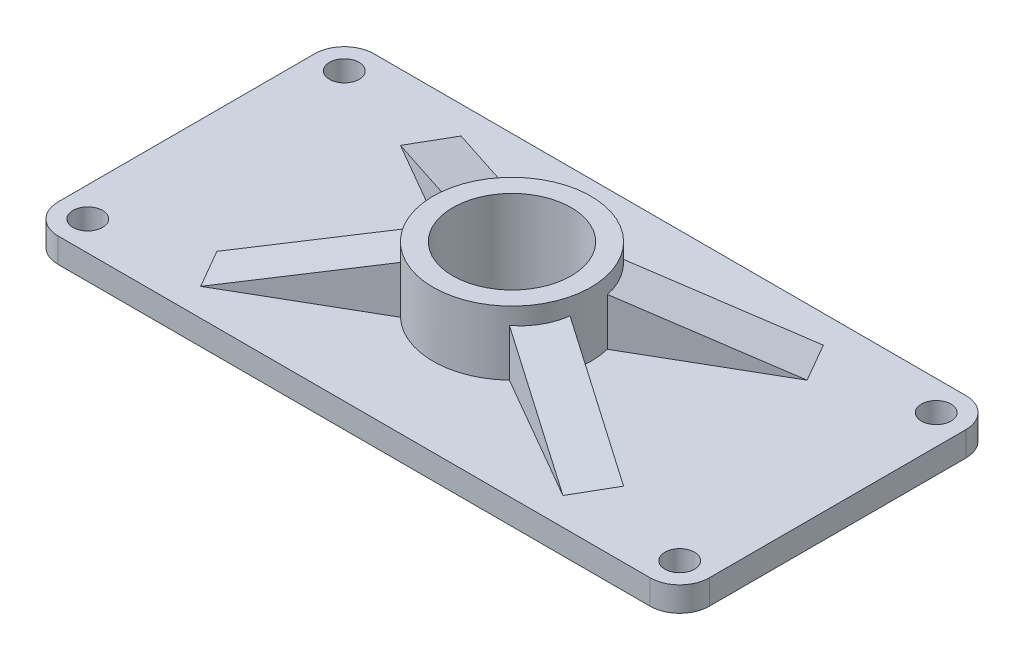
ISO-10303-21;
HEADER;
FILE_DESCRIPTION(('STEP AP214'),'2;1');
FILE_NAME('part.step','',(''),(''),'','','');
FILE_SCHEMA(('AUTOMOTIVE_DESIGN { 1 0 10303 214 1 1 1 1 }'));
ENDSEC;
DATA;
#1=APPLICATION_CONTEXT('core data for automotive mechanical design processes');
#2=APPLICATION_PROTOCOL_DEFINITION('international standard','automotive_design',2000,#1);
#3=PRODUCT_CONTEXT('',#1,'mechanical');
#4=PRODUCT('Part','Part','',(#3));
#5=PRODUCT_RELATED_PRODUCT_CATEGORY('part','',(#4));
#6=PRODUCT_DEFINITION_FORMATION('','',#4);
#7=PRODUCT_DEFINITION_CONTEXT('part definition',#1,'design');
#8=PRODUCT_DEFINITION('design','',#6,#7);
#9=PRODUCT_DEFINITION_SHAPE('','',#8);
#10=(LENGTH_UNIT() NAMED_UNIT(*) SI_UNIT(.MILLI.,.METRE.));
#11=(NAMED_UNIT(*) PLANE_ANGLE_UNIT() SI_UNIT($,.RADIAN.));
#12=(NAMED_UNIT(*) SI_UNIT($,.STERADIAN.) SOLID_ANGLE_UNIT());
#13=UNCERTAINTY_MEASURE_WITH_UNIT(LENGTH_MEASURE(1.E-05),#10,'distance_accuracy_value','');
#14=(GEOMETRIC_REPRESENTATION_CONTEXT(3) GLOBAL_UNCERTAINTY_ASSIGNED_CONTEXT((#13)) GLOBAL_UNIT_ASSIGNED_CONTEXT((#10,
#11,#12)) REPRESENTATION_CONTEXT('',''));
#15=CARTESIAN_POINT('',(0.,0.,0.));
#16=DIRECTION('',(0.,0.,1.));
#17=DIRECTION('',(1.,0.,0.));
#18=AXIS2_PLACEMENT_3D('',#15,#16,#17);
#19=CARTESIAN_POINT('',(0.,5.,0.));
#20=DIRECTION('',(0.,1.,0.));
#21=DIRECTION('',(0.,0.,1.));
#22=AXIS2_PLACEMENT_3D('',#19,#20,#21);
#23=PLANE('',#22);
#24=CARTESIAN_POINT('',(60.,5.,-26.));
#25=DIRECTION('',(0.,1.,0.));
#26=DIRECTION('',(0.,0.,1.));
#27=AXIS2_PLACEMENT_3D('',#24,#25,#26);
#28=CIRCLE('',#27,3.00000000000001);
#29=CARTESIAN_POINT('',(60.,5.,-23.));
#30=VERTEX_POINT('',#29);
#31=EDGE_CURVE('E246',#30,#30,#28,.T.);
#32=ORIENTED_EDGE('',*,*,#31,.F.);
#33=EDGE_LOOP('',(#32));
#34=FACE_BOUND('',#33,.T.);
#35=CARTESIAN_POINT('',(-60.,5.,-26.));
#36=DIRECTION('',(0.,1.,0.));
#37=DIRECTION('',(0.,0.,1.));
#38=AXIS2_PLACEMENT_3D('',#35,#36,#37);
#39=CIRCLE('',#38,3.);
#40=CARTESIAN_POINT('',(-60.,5.,-23.));
#41=VERTEX_POINT('',#40);
#42=EDGE_CURVE('E249',#41,#41,#39,.T.);
#43=ORIENTED_EDGE('',*,*,#42,.F.);
#44=EDGE_LOOP('',(#43));
#45=FACE_BOUND('',#44,.T.);
#46=CARTESIAN_POINT('',(-60.,5.,26.));
#47=DIRECTION('',(0.,1.,0.));
#48=DIRECTION('',(0.,0.,1.));
#49=AXIS2_PLACEMENT_3D('',#46,#47,#48);
#50=CIRCLE('',#49,3.);
#51=CARTESIAN_POINT('',(-60.,5.,29.));
#52=VERTEX_POINT('',#51);
#53=EDGE_CURVE('E253',#52,#52,#50,.T.);
#54=ORIENTED_EDGE('',*,*,#53,.F.);
#55=EDGE_LOOP('',(#54));
#56=FACE_BOUND('',#55,.T.);
#57=CARTESIAN_POINT('',(60.,5.,26.));
#58=DIRECTION('',(0.,1.,0.));
#59=DIRECTION('',(0.,0.,1.));
#60=AXIS2_PLACEMENT_3D('',#57,#58,#59);
#61=CIRCLE('',#60,3.00000000000001);
#62=CARTESIAN_POINT('',(60.,5.,29.));
#63=VERTEX_POINT('',#62);
#64=EDGE_CURVE('E256',#63,#63,#61,.T.);
#65=ORIENTED_EDGE('',*,*,#64,.F.);
#66=EDGE_LOOP('',(#65));
#67=FACE_BOUND('',#66,.T.);
#68=DIRECTION('',(-1.,0.,0.));
#69=VECTOR('',#68,1.);
#70=CARTESIAN_POINT('',(0.,5.,-32.));
#71=LINE('',#70,#69);
#72=CARTESIAN_POINT('',(60.,5.,-32.));
#73=VERTEX_POINT('',#72);
#74=CARTESIAN_POINT('',(-60.,5.,-32.));
#75=VERTEX_POINT('',#74);
#76=EDGE_CURVE('E262',#73,#75,#71,.T.);
#77=ORIENTED_EDGE('',*,*,#76,.T.);
#78=CARTESIAN_POINT('',(-60.,5.,-26.));
#79=DIRECTION('',(0.,1.,0.));
#80=DIRECTION('',(0.,0.,1.));
#81=AXIS2_PLACEMENT_3D('',#78,#79,#80);
#82=CIRCLE('',#81,6.);
#83=CARTESIAN_POINT('',(-66.,5.,-26.));
#84=VERTEX_POINT('',#83);
#85=EDGE_CURVE('E267',#75,#84,#82,.T.);
#86=ORIENTED_EDGE('',*,*,#85,.T.);
#87=DIRECTION('',(0.,0.,-1.));
#88=VECTOR('',#87,1.);
#89=CARTESIAN_POINT('',(-66.,5.,0.));
#90=LINE('',#89,#88);
#91=CARTESIAN_POINT('',(-66.,5.,26.));
#92=VERTEX_POINT('',#91);
#93=EDGE_CURVE('E269',#92,#84,#90,.T.);
#94=ORIENTED_EDGE('',*,*,#93,.F.);
#95=CARTESIAN_POINT('',(-60.,5.,26.));
#96=DIRECTION('',(0.,1.,0.));
#97=DIRECTION('',(0.,0.,1.));
#98=AXIS2_PLACEMENT_3D('',#95,#96,#97);
#99=CIRCLE('',#98,5.99999999999999);
#100=CARTESIAN_POINT('',(-60.,5.,32.));
#101=VERTEX_POINT('',#100);
#102=EDGE_CURVE('E272',#101,#92,#99,.F.);
#103=ORIENTED_EDGE('',*,*,#102,.F.);
#104=DIRECTION('',(-1.,0.,0.));
#105=VECTOR('',#104,1.);
#106=CARTESIAN_POINT('',(0.,5.,32.));
#107=LINE('',#106,#105);
#108=CARTESIAN_POINT('',(60.,5.,32.));
#109=VERTEX_POINT('',#108);
#110=EDGE_CURVE('E275',#109,#101,#107,.T.);
#111=ORIENTED_EDGE('',*,*,#110,.F.);
#112=CARTESIAN_POINT('',(60.,5.,26.));
#113=DIRECTION('',(0.,1.,0.));
#114=DIRECTION('',(0.,0.,1.));
#115=AXIS2_PLACEMENT_3D('',#112,#113,#114);
#116=CIRCLE('',#115,6.);
#117=CARTESIAN_POINT('',(66.,5.,26.));
#118=VERTEX_POINT('',#117);
#119=EDGE_CURVE('E278',#109,#118,#116,.T.);
#120=ORIENTED_EDGE('',*,*,#119,.T.);
#121=DIRECTION('',(0.,0.,-1.));
#122=VECTOR('',#121,1.);
#123=CARTESIAN_POINT('',(66.,5.,0.));
#124=LINE('',#123,#122);
#125=CARTESIAN_POINT('',(66.,5.,-26.));
#126=VERTEX_POINT('',#125);
#127=EDGE_CURVE('E280',#118,#126,#124,.T.);
#128=ORIENTED_EDGE('',*,*,#127,.T.);
#129=CARTESIAN_POINT('',(60.,5.,-26.));
#130=DIRECTION('',(0.,1.,0.));
#131=DIRECTION('',(0.,0.,1.));
#132=AXIS2_PLACEMENT_3D('',#129,#130,#131);
#133=CIRCLE('',#132,6.);
#134=EDGE_CURVE('E282',#126,#73,#133,.T.);
#135=ORIENTED_EDGE('',*,*,#134,.T.);
#136=EDGE_LOOP('',(#77,#86,#94,#103,#111,#120,#128,#135));
#137=FACE_BOUND('',#136,.T.);
#138=DIRECTION('',(-0.499999999999995,0.,-0.866025403784442));
#139=VECTOR('',#138,1.);
#140=CARTESIAN_POINT('',(41.2211431702999,4.99999999999999,-18.6028856829698));
#141=LINE('',#140,#139);
#142=CARTESIAN_POINT('',(41.2211431702999,4.99999999999999,-18.6028856829698));
#143=VERTEX_POINT('',#142);
#144=CARTESIAN_POINT('',(36.7211431702999,4.99999999999999,-26.3971143170298));
#145=VERTEX_POINT('',#144);
#146=EDGE_CURVE('E178',#143,#145,#141,.T.);
#147=ORIENTED_EDGE('',*,*,#146,.F.);
#148=DIRECTION('',(-0.866025403784442,0.,0.499999999999995));
#149=VECTOR('',#148,1.);
#150=CARTESIAN_POINT('',(41.2211431702999,4.99999999999999,-18.6028856829698));
#151=LINE('',#150,#149);
#152=CARTESIAN_POINT('',(15.5470861469722,5.,-3.77996194936197));
#153=VERTEX_POINT('',#152);
#154=EDGE_CURVE('E183',#143,#153,#151,.T.);
#155=ORIENTED_EDGE('',*,*,#154,.T.);
#156=CARTESIAN_POINT('',(0.,5.,0.));
#157=DIRECTION('',(0.,1.,0.));
#158=DIRECTION('',(0.,0.,1.));
#159=AXIS2_PLACEMENT_3D('',#156,#157,#158);
#160=CIRCLE('',#159,16.);
#161=CARTESIAN_POINT('',(15.5470861469722,5.,3.77996194936197));
#162=VERTEX_POINT('',#161);
#163=EDGE_CURVE('E264',#162,#153,#160,.T.);
#164=ORIENTED_EDGE('',*,*,#163,.F.);
#165=DIRECTION('',(-0.866025403784442,0.,-0.499999999999995));
#166=VECTOR('',#165,1.);
#167=CARTESIAN_POINT('',(41.2211431702999,4.99999999999999,18.6028856829698));
#168=LINE('',#167,#166);
#169=CARTESIAN_POINT('',(41.2211431702999,4.99999999999999,18.6028856829698));
#170=VERTEX_POINT('',#169);
#171=EDGE_CURVE('E213',#170,#162,#168,.T.);
#172=ORIENTED_EDGE('',*,*,#171,.F.);
#173=DIRECTION('',(-0.499999999999995,0.,0.866025403784442));
#174=VECTOR('',#173,1.);
#175=CARTESIAN_POINT('',(41.2211431702999,4.99999999999999,18.6028856829698));
#176=LINE('',#175,#174);
#177=CARTESIAN_POINT('',(36.7211431702999,4.99999999999999,26.3971143170298));
#178=VERTEX_POINT('',#177);
#179=EDGE_CURVE('E216',#170,#178,#176,.T.);
#180=ORIENTED_EDGE('',*,*,#179,.T.);
#181=DIRECTION('',(-0.866025403784442,0.,-0.499999999999995));
#182=VECTOR('',#181,1.);
#183=CARTESIAN_POINT('',(36.7211431702999,4.99999999999999,26.3971143170298));
#184=LINE('',#183,#182);
#185=CARTESIAN_POINT('',(11.0470861469723,5.,11.5741905834219));
#186=VERTEX_POINT('',#185);
#187=EDGE_CURVE('E214',#178,#186,#184,.T.);
#188=ORIENTED_EDGE('',*,*,#187,.T.);
#189=CARTESIAN_POINT('',(-11.0470861469723,5.,11.574190583422));
#190=VERTEX_POINT('',#189);
#191=EDGE_CURVE('E263',#190,#186,#160,.T.);
#192=ORIENTED_EDGE('',*,*,#191,.F.);
#193=DIRECTION('',(-0.866025403784442,0.,0.499999999999995));
#194=VECTOR('',#193,1.);
#195=CARTESIAN_POINT('',(-36.7211431702999,4.99999999999999,26.3971143170298));
#196=LINE('',#195,#194);
#197=CARTESIAN_POINT('',(-36.7211431702999,5.,26.3971143170298));
#198=VERTEX_POINT('',#197);
#199=EDGE_CURVE('E59',#190,#198,#196,.T.);
#200=ORIENTED_EDGE('',*,*,#199,.T.);
#201=DIRECTION('',(-0.499999999999995,0.,-0.866025403784442));
#202=VECTOR('',#201,1.);
#203=CARTESIAN_POINT('',(-36.7211431702999,4.99999999999999,26.3971143170298));
#204=LINE('',#203,#202);
#205=CARTESIAN_POINT('',(-41.2211431702999,5.,18.6028856829698));
#206=VERTEX_POINT('',#205);
#207=EDGE_CURVE('E202',#198,#206,#204,.T.);
#208=ORIENTED_EDGE('',*,*,#207,.T.);
#209=DIRECTION('',(-0.866025403784442,0.,0.499999999999995));
#210=VECTOR('',#209,1.);
#211=CARTESIAN_POINT('',(-41.2211431702999,4.99999999999999,18.6028856829698));
#212=LINE('',#211,#210);
#213=CARTESIAN_POINT('',(-15.5470861469722,5.,3.77996194936198));
#214=VERTEX_POINT('',#213);
#215=EDGE_CURVE('E200',#214,#206,#212,.T.);
#216=ORIENTED_EDGE('',*,*,#215,.F.);
#217=CARTESIAN_POINT('',(-15.5470861469722,5.,-3.77996194936198));
#218=VERTEX_POINT('',#217);
#219=EDGE_CURVE('E260',#218,#214,#160,.T.);
#220=ORIENTED_EDGE('',*,*,#219,.F.);
#221=DIRECTION('',(-0.866025403784442,0.,-0.499999999999995));
#222=VECTOR('',#221,1.);
#223=CARTESIAN_POINT('',(-41.2211431702999,4.99999999999999,-18.6028856829698));
#224=LINE('',#223,#222);
#225=CARTESIAN_POINT('',(-41.2211431702998,5.,-18.6028856829698));
#226=VERTEX_POINT('',#225);
#227=EDGE_CURVE('E222',#218,#226,#224,.T.);
#228=ORIENTED_EDGE('',*,*,#227,.T.);
#229=DIRECTION('',(-0.499999999999995,0.,0.866025403784442));
#230=VECTOR('',#229,1.);
#231=CARTESIAN_POINT('',(-36.7211431702999,4.99999999999999,-26.3971143170298));
#232=LINE('',#231,#230);
#233=CARTESIAN_POINT('',(-36.7211431702999,5.,-26.3971143170297));
#234=VERTEX_POINT('',#233);
#235=EDGE_CURVE('E230',#234,#226,#232,.T.);
#236=ORIENTED_EDGE('',*,*,#235,.F.);
#237=DIRECTION('',(-0.866025403784442,0.,-0.499999999999995));
#238=VECTOR('',#237,1.);
#239=CARTESIAN_POINT('',(-36.7211431702999,4.99999999999999,-26.3971143170298));
#240=LINE('',#239,#238);
#241=CARTESIAN_POINT('',(-11.0470861469723,5.,-11.574190583422));
#242=VERTEX_POINT('',#241);
#243=EDGE_CURVE('E223',#242,#234,#240,.T.);
#244=ORIENTED_EDGE('',*,*,#243,.F.);
#245=CARTESIAN_POINT('',(11.0470861469723,5.,-11.5741905834219));
#246=VERTEX_POINT('',#245);
#247=EDGE_CURVE('E259',#246,#242,#160,.T.);
#248=ORIENTED_EDGE('',*,*,#247,.F.);
#249=DIRECTION('',(-0.866025403784442,0.,0.499999999999995));
#250=VECTOR('',#249,1.);
#251=CARTESIAN_POINT('',(36.7211431702999,4.99999999999999,-26.3971143170298));
#252=LINE('',#251,#250);
#253=EDGE_CURVE('E51',#145,#246,#252,.T.);
#254=ORIENTED_EDGE('',*,*,#253,.F.);
#255=EDGE_LOOP('',(#147,#155,#164,#172,#180,#188,#192,#200,#208,#216,#220,#228,#236,#244,#248,#254));
#256=FACE_BOUND('',#255,.T.);
#257=ADVANCED_FACE('F36',(#34,#45,#56,#67,#137,#256),#23,.T.);
#258=CARTESIAN_POINT('',(0.,18.,0.));
#259=DIRECTION('',(0.,-1.,0.));
#260=DIRECTION('',(0.,0.,-1.));
#261=AXIS2_PLACEMENT_3D('',#258,#259,#260);
#262=CYLINDRICAL_SURFACE('',#261,16.);
#263=CARTESIAN_POINT('',(0.,18.,0.));
#264=DIRECTION('',(0.,1.,0.));
#265=DIRECTION('',(0.,0.,1.));
#266=AXIS2_PLACEMENT_3D('',#263,#264,#265);
#267=CIRCLE('',#266,16.);
#268=CARTESIAN_POINT('',(0.,18.,16.));
#269=VERTEX_POINT('',#268);
#270=EDGE_CURVE('E240',#269,#269,#267,.T.);
#271=ORIENTED_EDGE('',*,*,#270,.F.);
#272=EDGE_LOOP('',(#271));
#273=FACE_BOUND('',#272,.T.);
#274=DIRECTION('',(0.,-1.,0.));
#275=VECTOR('',#274,1.);
#276=CARTESIAN_POINT('',(15.5470861469722,18.,-3.77996194936197));
#277=LINE('',#276,#275);
#278=CARTESIAN_POINT('',(15.5470861469722,14.6325197536146,-3.77996194936197));
#279=VERTEX_POINT('',#278);
#280=EDGE_CURVE('E11',#279,#153,#277,.T.);
#281=ORIENTED_EDGE('',*,*,#280,.F.);
#282=CARTESIAN_POINT('',(0.,19.6213863304805,0.));
#283=DIRECTION('',(0.267616567329813,0.951056516295156,-0.154508497187469));
#284=DIRECTION('',(0.823639103546337,-0.309016994374941,-0.475528258147573));
#285=AXIS2_PLACEMENT_3D('',#282,#283,#284);
#286=ELLIPSE('',#285,16.8233955878122,16.);
#287=CARTESIAN_POINT('',(11.0470861469723,14.6325197536146,-11.5741905834219));
#288=VERTEX_POINT('',#287);
#289=EDGE_CURVE('E180',#279,#288,#286,.T.);
#290=ORIENTED_EDGE('',*,*,#289,.T.);
#291=DIRECTION('',(0.,-1.,0.));
#292=VECTOR('',#291,1.);
#293=CARTESIAN_POINT('',(11.0470861469723,18.,-11.5741905834219));
#294=LINE('',#293,#292);
#295=EDGE_CURVE('E44',#288,#246,#294,.T.);
#296=ORIENTED_EDGE('',*,*,#295,.T.);
#297=ORIENTED_EDGE('',*,*,#247,.T.);
#298=DIRECTION('',(0.,-1.,0.));
#299=VECTOR('',#298,1.);
#300=CARTESIAN_POINT('',(-11.0470861469723,18.,-11.574190583422));
#301=LINE('',#300,#299);
#302=CARTESIAN_POINT('',(-11.0470861469723,14.6325197536146,-11.574190583422));
#303=VERTEX_POINT('',#302);
#304=EDGE_CURVE('E341',#242,#303,#301,.F.);
#305=ORIENTED_EDGE('',*,*,#304,.T.);
#306=CARTESIAN_POINT('',(0.,19.6213863304805,0.));
#307=DIRECTION('',(0.267616567329813,-0.951056516295156,0.154508497187469));
#308=DIRECTION('',(-0.823639103546337,-0.309016994374941,-0.475528258147573));
#309=AXIS2_PLACEMENT_3D('',#306,#307,#308);
#310=ELLIPSE('',#309,16.8233955878122,16.);
#311=CARTESIAN_POINT('',(-15.5470861469722,14.6325197536146,-3.77996194936198));
#312=VERTEX_POINT('',#311);
#313=EDGE_CURVE('E338',#312,#303,#310,.T.);
#314=ORIENTED_EDGE('',*,*,#313,.F.);
#315=DIRECTION('',(0.,-1.,0.));
#316=VECTOR('',#315,1.);
#317=CARTESIAN_POINT('',(-15.5470861469722,18.,-3.77996194936198));
#318=LINE('',#317,#316);
#319=EDGE_CURVE('E335',#218,#312,#318,.F.);
#320=ORIENTED_EDGE('',*,*,#319,.F.);
#321=ORIENTED_EDGE('',*,*,#219,.T.);
#322=DIRECTION('',(0.,-1.,0.));
#323=VECTOR('',#322,1.);
#324=CARTESIAN_POINT('',(-15.5470861469722,18.,3.77996194936198));
#325=LINE('',#324,#323);
#326=CARTESIAN_POINT('',(-15.5470861469722,14.6325197536146,3.77996194936198));
#327=VERTEX_POINT('',#326);
#328=EDGE_CURVE('E351',#327,#214,#325,.T.);
#329=ORIENTED_EDGE('',*,*,#328,.F.);
#330=CARTESIAN_POINT('',(0.,19.6213863304805,0.));
#331=DIRECTION('',(-0.267616567329813,0.951056516295156,0.154508497187469));
#332=DIRECTION('',(-0.823639103546337,-0.309016994374941,0.475528258147573));
#333=AXIS2_PLACEMENT_3D('',#330,#331,#332);
#334=ELLIPSE('',#333,16.8233955878122,16.);
#335=CARTESIAN_POINT('',(-11.0470861469723,14.6325197536146,11.574190583422));
#336=VERTEX_POINT('',#335);
#337=EDGE_CURVE('E208',#327,#336,#334,.T.);
#338=ORIENTED_EDGE('',*,*,#337,.T.);
#339=DIRECTION('',(0.,-1.,0.));
#340=VECTOR('',#339,1.);
#341=CARTESIAN_POINT('',(-11.0470861469723,18.,11.574190583422));
#342=LINE('',#341,#340);
#343=EDGE_CURVE('E354',#336,#190,#342,.T.);
#344=ORIENTED_EDGE('',*,*,#343,.T.);
#345=ORIENTED_EDGE('',*,*,#191,.T.);
#346=DIRECTION('',(0.,-1.,0.));
#347=VECTOR('',#346,1.);
#348=CARTESIAN_POINT('',(11.0470861469723,18.,11.5741905834219));
#349=LINE('',#348,#347);
#350=CARTESIAN_POINT('',(11.0470861469723,14.6325197536146,11.5741905834219));
#351=VERTEX_POINT('',#350);
#352=EDGE_CURVE('E343',#186,#351,#349,.F.);
#353=ORIENTED_EDGE('',*,*,#352,.T.);
#354=CARTESIAN_POINT('',(0.,19.6213863304805,0.));
#355=DIRECTION('',(-0.267616567329813,-0.951056516295156,-0.154508497187469));
#356=DIRECTION('',(0.823639103546337,-0.309016994374941,0.475528258147573));
#357=AXIS2_PLACEMENT_3D('',#354,#355,#356);
#358=ELLIPSE('',#357,16.8233955878122,16.);
#359=CARTESIAN_POINT('',(15.5470861469722,14.6325197536146,3.77996194936197));
#360=VERTEX_POINT('',#359);
#361=EDGE_CURVE('E346',#360,#351,#358,.T.);
#362=ORIENTED_EDGE('',*,*,#361,.F.);
#363=DIRECTION('',(0.,-1.,0.));
#364=VECTOR('',#363,1.);
#365=CARTESIAN_POINT('',(15.5470861469722,18.,3.77996194936197));
#366=LINE('',#365,#364);
#367=EDGE_CURVE('E349',#162,#360,#366,.F.);
#368=ORIENTED_EDGE('',*,*,#367,.F.);
#369=ORIENTED_EDGE('',*,*,#163,.T.);
#370=EDGE_LOOP('',(#281,#290,#296,#297,#305,#314,#320,#321,#329,#338,#344,#345,#353,#362,#368,#369));
#371=FACE_BOUND('',#370,.T.);
#372=ADVANCED_FACE('F356',(#273,#371),#262,.T.);
#373=CARTESIAN_POINT('',(0.,5.,-32.));
#374=DIRECTION('',(0.,0.,1.));
#375=DIRECTION('',(1.,0.,0.));
#376=AXIS2_PLACEMENT_3D('',#373,#374,#375);
#377=PLANE('',#376);
#378=DIRECTION('',(-1.,0.,0.));
#379=VECTOR('',#378,1.);
#380=CARTESIAN_POINT('',(0.,0.,-32.));
#381=LINE('',#380,#379);
#382=CARTESIAN_POINT('',(60.,0.,-32.));
#383=VERTEX_POINT('',#382);
#384=CARTESIAN_POINT('',(-60.,0.,-32.));
#385=VERTEX_POINT('',#384);
#386=EDGE_CURVE('E296',#383,#385,#381,.T.);
#387=ORIENTED_EDGE('',*,*,#386,.T.);
#388=DIRECTION('',(0.,-1.,0.));
#389=VECTOR('',#388,1.);
#390=CARTESIAN_POINT('',(-60.,5.,-32.));
#391=LINE('',#390,#389);
#392=EDGE_CURVE('E332',#75,#385,#391,.T.);
#393=ORIENTED_EDGE('',*,*,#392,.F.);
#394=ORIENTED_EDGE('',*,*,#76,.F.);
#395=DIRECTION('',(0.,-1.,0.));
#396=VECTOR('',#395,1.);
#397=CARTESIAN_POINT('',(60.,5.,-32.));
#398=LINE('',#397,#396);
#399=EDGE_CURVE('E284',#73,#383,#398,.T.);
#400=ORIENTED_EDGE('',*,*,#399,.T.);
#401=EDGE_LOOP('',(#387,#393,#394,#400));
#402=FACE_BOUND('',#401,.T.);
#403=ADVANCED_FACE('F391',(#402),#377,.F.);
#404=CARTESIAN_POINT('',(-60.,5.,-26.));
#405=DIRECTION('',(0.,-1.,0.));
#406=DIRECTION('',(0.,0.,-1.));
#407=AXIS2_PLACEMENT_3D('',#404,#405,#406);
#408=CYLINDRICAL_SURFACE('',#407,6.);
#409=CARTESIAN_POINT('',(-60.,0.,-26.));
#410=DIRECTION('',(0.,1.,0.));
#411=DIRECTION('',(0.,0.,1.));
#412=AXIS2_PLACEMENT_3D('',#409,#410,#411);
#413=CIRCLE('',#412,6.);
#414=CARTESIAN_POINT('',(-66.,0.,-26.));
#415=VERTEX_POINT('',#414);
#416=EDGE_CURVE('E299',#385,#415,#413,.T.);
#417=ORIENTED_EDGE('',*,*,#416,.T.);
#418=DIRECTION('',(0.,-1.,0.));
#419=VECTOR('',#418,1.);
#420=CARTESIAN_POINT('',(-66.,5.,-26.));
#421=LINE('',#420,#419);
#422=EDGE_CURVE('E330',#84,#415,#421,.T.);
#423=ORIENTED_EDGE('',*,*,#422,.F.);
#424=ORIENTED_EDGE('',*,*,#85,.F.);
#425=ORIENTED_EDGE('',*,*,#392,.T.);
#426=EDGE_LOOP('',(#417,#423,#424,#425));
#427=FACE_BOUND('',#426,.T.);
#428=ADVANCED_FACE('F427',(#427),#408,.T.);
#429=CARTESIAN_POINT('',(-66.,5.,0.));
#430=DIRECTION('',(-1.,0.,0.));
#431=DIRECTION('',(0.,0.,1.));
#432=AXIS2_PLACEMENT_3D('',#429,#430,#431);
#433=PLANE('',#432);
#434=DIRECTION('',(0.,0.,-1.));
#435=VECTOR('',#434,1.);
#436=CARTESIAN_POINT('',(-66.,0.,0.));
#437=LINE('',#436,#435);
#438=CARTESIAN_POINT('',(-66.,0.,26.));
#439=VERTEX_POINT('',#438);
#440=EDGE_CURVE('E302',#439,#415,#437,.T.);
#441=ORIENTED_EDGE('',*,*,#440,.F.);
#442=DIRECTION('',(0.,-1.,0.));
#443=VECTOR('',#442,1.);
#444=CARTESIAN_POINT('',(-66.,5.,26.));
#445=LINE('',#444,#443);
#446=EDGE_CURVE('E328',#92,#439,#445,.T.);
#447=ORIENTED_EDGE('',*,*,#446,.F.);
#448=ORIENTED_EDGE('',*,*,#93,.T.);
#449=ORIENTED_EDGE('',*,*,#422,.T.);
#450=EDGE_LOOP('',(#441,#447,#448,#449));
#451=FACE_BOUND('',#450,.T.);
#452=ADVANCED_FACE('F423',(#451),#433,.T.);
#453=CARTESIAN_POINT('',(-60.,5.,26.));
#454=DIRECTION('',(0.,-1.,0.));
#455=DIRECTION('',(0.,0.,-1.));
#456=AXIS2_PLACEMENT_3D('',#453,#454,#455);
#457=CYLINDRICAL_SURFACE('',#456,5.99999999999999);
#458=CARTESIAN_POINT('',(-60.,0.,26.));
#459=DIRECTION('',(0.,1.,0.));
#460=DIRECTION('',(0.,0.,1.));
#461=AXIS2_PLACEMENT_3D('',#458,#459,#460);
#462=CIRCLE('',#461,5.99999999999999);
#463=CARTESIAN_POINT('',(-60.,0.,32.));
#464=VERTEX_POINT('',#463);
#465=EDGE_CURVE('E305',#464,#439,#462,.F.);
#466=ORIENTED_EDGE('',*,*,#465,.F.);
#467=DIRECTION('',(0.,-1.,0.));
#468=VECTOR('',#467,1.);
#469=CARTESIAN_POINT('',(-60.,5.,32.));
#470=LINE('',#469,#468);
#471=EDGE_CURVE('E326',#101,#464,#470,.T.);
#472=ORIENTED_EDGE('',*,*,#471,.F.);
#473=ORIENTED_EDGE('',*,*,#102,.T.);
#474=ORIENTED_EDGE('',*,*,#446,.T.);
#475=EDGE_LOOP('',(#466,#472,#473,#474));
#476=FACE_BOUND('',#475,.T.);
#477=ADVANCED_FACE('F419',(#476),#457,.T.);
#478=CARTESIAN_POINT('',(0.,5.,32.));
#479=DIRECTION('',(0.,0.,1.));
#480=DIRECTION('',(1.,0.,0.));
#481=AXIS2_PLACEMENT_3D('',#478,#479,#480);
#482=PLANE('',#481);
#483=DIRECTION('',(-1.,0.,0.));
#484=VECTOR('',#483,1.);
#485=CARTESIAN_POINT('',(0.,0.,32.));
#486=LINE('',#485,#484);
#487=CARTESIAN_POINT('',(60.,0.,32.));
#488=VERTEX_POINT('',#487);
#489=EDGE_CURVE('E308',#488,#464,#486,.T.);
#490=ORIENTED_EDGE('',*,*,#489,.F.);
#491=DIRECTION('',(0.,-1.,0.));
#492=VECTOR('',#491,1.);
#493=CARTESIAN_POINT('',(60.,5.,32.));
#494=LINE('',#493,#492);
#495=EDGE_CURVE('E324',#109,#488,#494,.T.);
#496=ORIENTED_EDGE('',*,*,#495,.F.);
#497=ORIENTED_EDGE('',*,*,#110,.T.);
#498=ORIENTED_EDGE('',*,*,#471,.T.);
#499=EDGE_LOOP('',(#490,#496,#497,#498));
#500=FACE_BOUND('',#499,.T.);
#501=ADVANCED_FACE('F415',(#500),#482,.T.);
#502=CARTESIAN_POINT('',(60.,5.,26.));
#503=DIRECTION('',(0.,-1.,0.));
#504=DIRECTION('',(0.,0.,-1.));
#505=AXIS2_PLACEMENT_3D('',#502,#503,#504);
#506=CYLINDRICAL_SURFACE('',#505,6.);
#507=CARTESIAN_POINT('',(60.,0.,26.));
#508=DIRECTION('',(0.,1.,0.));
#509=DIRECTION('',(0.,0.,1.));
#510=AXIS2_PLACEMENT_3D('',#507,#508,#509);
#511=CIRCLE('',#510,6.);
#512=CARTESIAN_POINT('',(66.,0.,26.));
#513=VERTEX_POINT('',#512);
#514=EDGE_CURVE('E311',#488,#513,#511,.T.);
#515=ORIENTED_EDGE('',*,*,#514,.T.);
#516=DIRECTION('',(0.,-1.,0.));
#517=VECTOR('',#516,1.);
#518=CARTESIAN_POINT('',(66.,5.,26.));
#519=LINE('',#518,#517);
#520=EDGE_CURVE('E321',#118,#513,#519,.T.);
#521=ORIENTED_EDGE('',*,*,#520,.F.);
#522=ORIENTED_EDGE('',*,*,#119,.F.);
#523=ORIENTED_EDGE('',*,*,#495,.T.);
#524=EDGE_LOOP('',(#515,#521,#522,#523));
#525=FACE_BOUND('',#524,.T.);
#526=ADVANCED_FACE('F411',(#525),#506,.T.);
#527=CARTESIAN_POINT('',(66.,5.,0.));
#528=DIRECTION('',(-1.,0.,0.));
#529=DIRECTION('',(0.,0.,1.));
#530=AXIS2_PLACEMENT_3D('',#527,#528,#529);
#531=PLANE('',#530);
#532=DIRECTION('',(0.,0.,-1.));
#533=VECTOR('',#532,1.);
#534=CARTESIAN_POINT('',(66.,0.,0.));
#535=LINE('',#534,#533);
#536=CARTESIAN_POINT('',(66.,0.,-26.));
#537=VERTEX_POINT('',#536);
#538=EDGE_CURVE('E313',#513,#537,#535,.T.);
#539=ORIENTED_EDGE('',*,*,#538,.T.);
#540=DIRECTION('',(0.,-1.,0.));
#541=VECTOR('',#540,1.);
#542=CARTESIAN_POINT('',(66.,5.,-26.));
#543=LINE('',#542,#541);
#544=EDGE_CURVE('E318',#126,#537,#543,.T.);
#545=ORIENTED_EDGE('',*,*,#544,.F.);
#546=ORIENTED_EDGE('',*,*,#127,.F.);
#547=ORIENTED_EDGE('',*,*,#520,.T.);
#548=EDGE_LOOP('',(#539,#545,#546,#547));
#549=FACE_BOUND('',#548,.T.);
#550=ADVANCED_FACE('F407',(#549),#531,.F.);
#551=CARTESIAN_POINT('',(60.,5.,26.));
#552=DIRECTION('',(0.,-1.,0.));
#553=DIRECTION('',(0.,0.,-1.));
#554=AXIS2_PLACEMENT_3D('',#551,#552,#553);
#555=CYLINDRICAL_SURFACE('',#554,3.00000000000001);
#556=ORIENTED_EDGE('',*,*,#64,.T.);
#557=EDGE_LOOP('',(#556));
#558=FACE_BOUND('',#557,.T.);
#559=CARTESIAN_POINT('',(60.,0.,26.));
#560=DIRECTION('',(0.,1.,0.));
#561=DIRECTION('',(0.,0.,1.));
#562=AXIS2_PLACEMENT_3D('',#559,#560,#561);
#563=CIRCLE('',#562,3.00000000000001);
#564=CARTESIAN_POINT('',(60.,0.,29.));
#565=VERTEX_POINT('',#564);
#566=EDGE_CURVE('E293',#565,#565,#563,.T.);
#567=ORIENTED_EDGE('',*,*,#566,.F.);
#568=EDGE_LOOP('',(#567));
#569=FACE_BOUND('',#568,.T.);
#570=ADVANCED_FACE('F410',(#558,#569),#555,.F.);
#571=CARTESIAN_POINT('',(-60.,5.,26.));
#572=DIRECTION('',(0.,-1.,0.));
#573=DIRECTION('',(0.,0.,-1.));
#574=AXIS2_PLACEMENT_3D('',#571,#572,#573);
#575=CYLINDRICAL_SURFACE('',#574,3.);
#576=ORIENTED_EDGE('',*,*,#53,.T.);
#577=EDGE_LOOP('',(#576));
#578=FACE_BOUND('',#577,.T.);
#579=CARTESIAN_POINT('',(-60.,0.,26.));
#580=DIRECTION('',(0.,1.,0.));
#581=DIRECTION('',(0.,0.,1.));
#582=AXIS2_PLACEMENT_3D('',#579,#580,#581);
#583=CIRCLE('',#582,3.);
#584=CARTESIAN_POINT('',(-60.,0.,29.));
#585=VERTEX_POINT('',#584);
#586=EDGE_CURVE('E290',#585,#585,#583,.T.);
#587=ORIENTED_EDGE('',*,*,#586,.F.);
#588=EDGE_LOOP('',(#587));
#589=FACE_BOUND('',#588,.T.);
#590=ADVANCED_FACE('F437',(#578,#589),#575,.F.);
#591=CARTESIAN_POINT('',(-60.,5.,-26.));
#592=DIRECTION('',(0.,-1.,0.));
#593=DIRECTION('',(0.,0.,-1.));
#594=AXIS2_PLACEMENT_3D('',#591,#592,#593);
#595=CYLINDRICAL_SURFACE('',#594,3.);
#596=ORIENTED_EDGE('',*,*,#42,.T.);
#597=EDGE_LOOP('',(#596));
#598=FACE_BOUND('',#597,.T.);
#599=CARTESIAN_POINT('',(-60.,0.,-26.));
#600=DIRECTION('',(0.,1.,0.));
#601=DIRECTION('',(0.,0.,1.));
#602=AXIS2_PLACEMENT_3D('',#599,#600,#601);
#603=CIRCLE('',#602,3.);
#604=CARTESIAN_POINT('',(-60.,0.,-23.));
#605=VERTEX_POINT('',#604);
#606=EDGE_CURVE('E287',#605,#605,#603,.T.);
#607=ORIENTED_EDGE('',*,*,#606,.F.);
#608=EDGE_LOOP('',(#607));
#609=FACE_BOUND('',#608,.T.);
#610=ADVANCED_FACE('F440',(#598,#609),#595,.F.);
#611=CARTESIAN_POINT('',(60.,5.,-26.));
#612=DIRECTION('',(0.,-1.,0.));
#613=DIRECTION('',(0.,0.,-1.));
#614=AXIS2_PLACEMENT_3D('',#611,#612,#613);
#615=CYLINDRICAL_SURFACE('',#614,3.00000000000001);
#616=ORIENTED_EDGE('',*,*,#31,.T.);
#617=EDGE_LOOP('',(#616));
#618=FACE_BOUND('',#617,.T.);
#619=CARTESIAN_POINT('',(60.,0.,-26.));
#620=DIRECTION('',(0.,1.,0.));
#621=DIRECTION('',(0.,0.,1.));
#622=AXIS2_PLACEMENT_3D('',#619,#620,#621);
#623=CIRCLE('',#622,3.00000000000001);
#624=CARTESIAN_POINT('',(60.,0.,-23.));
#625=VERTEX_POINT('',#624);
#626=EDGE_CURVE('E243',#625,#625,#623,.T.);
#627=ORIENTED_EDGE('',*,*,#626,.F.);
#628=EDGE_LOOP('',(#627));
#629=FACE_BOUND('',#628,.T.);
#630=ADVANCED_FACE('F38',(#618,#629),#615,.F.);
#631=CARTESIAN_POINT('',(60.,5.,-26.));
#632=DIRECTION('',(0.,-1.,0.));
#633=DIRECTION('',(0.,0.,-1.));
#634=AXIS2_PLACEMENT_3D('',#631,#632,#633);
#635=CYLINDRICAL_SURFACE('',#634,6.);
#636=CARTESIAN_POINT('',(60.,0.,-26.));
#637=DIRECTION('',(0.,1.,0.));
#638=DIRECTION('',(0.,0.,1.));
#639=AXIS2_PLACEMENT_3D('',#636,#637,#638);
#640=CIRCLE('',#639,6.);
#641=EDGE_CURVE('E250',#537,#383,#640,.T.);
#642=ORIENTED_EDGE('',*,*,#641,.T.);
#643=ORIENTED_EDGE('',*,*,#399,.F.);
#644=ORIENTED_EDGE('',*,*,#134,.F.);
#645=ORIENTED_EDGE('',*,*,#544,.T.);
#646=EDGE_LOOP('',(#642,#643,#644,#645));
#647=FACE_BOUND('',#646,.T.);
#648=ADVANCED_FACE('F402',(#647),#635,.T.);
#649=CARTESIAN_POINT('',(0.,0.,0.));
#650=DIRECTION('',(0.,1.,0.));
#651=DIRECTION('',(0.,0.,1.));
#652=AXIS2_PLACEMENT_3D('',#649,#650,#651);
#653=PLANE('',#652);
#654=ORIENTED_EDGE('',*,*,#626,.T.);
#655=EDGE_LOOP('',(#654));
#656=FACE_BOUND('',#655,.T.);
#657=ORIENTED_EDGE('',*,*,#606,.T.);
#658=EDGE_LOOP('',(#657));
#659=FACE_BOUND('',#658,.T.);
#660=ORIENTED_EDGE('',*,*,#586,.T.);
#661=EDGE_LOOP('',(#660));
#662=FACE_BOUND('',#661,.T.);
#663=ORIENTED_EDGE('',*,*,#566,.T.);
#664=EDGE_LOOP('',(#663));
#665=FACE_BOUND('',#664,.T.);
#666=ORIENTED_EDGE('',*,*,#386,.F.);
#667=ORIENTED_EDGE('',*,*,#641,.F.);
#668=ORIENTED_EDGE('',*,*,#538,.F.);
#669=ORIENTED_EDGE('',*,*,#514,.F.);
#670=ORIENTED_EDGE('',*,*,#489,.T.);
#671=ORIENTED_EDGE('',*,*,#465,.T.);
#672=ORIENTED_EDGE('',*,*,#440,.T.);
#673=ORIENTED_EDGE('',*,*,#416,.F.);
#674=EDGE_LOOP('',(#666,#667,#668,#669,#670,#671,#672,#673));
#675=FACE_BOUND('',#674,.T.);
#676=CARTESIAN_POINT('',(0.,0.,0.));
#677=DIRECTION('',(0.,1.,0.));
#678=DIRECTION('',(0.,0.,1.));
#679=AXIS2_PLACEMENT_3D('',#676,#677,#678);
#680=CIRCLE('',#679,12.);
#681=CARTESIAN_POINT('',(0.,0.,12.));
#682=VERTEX_POINT('',#681);
#683=EDGE_CURVE('E236',#682,#682,#680,.T.);
#684=ORIENTED_EDGE('',*,*,#683,.T.);
#685=EDGE_LOOP('',(#684));
#686=FACE_BOUND('',#685,.T.);
#687=ADVANCED_FACE('F399',(#656,#659,#662,#665,#675,#686),#653,.F.);
#688=CARTESIAN_POINT('',(0.,18.,0.));
#689=DIRECTION('',(0.,-1.,0.));
#690=DIRECTION('',(0.,0.,-1.));
#691=AXIS2_PLACEMENT_3D('',#688,#689,#690);
#692=CYLINDRICAL_SURFACE('',#691,12.);
#693=CARTESIAN_POINT('',(0.,18.,0.));
#694=DIRECTION('',(0.,1.,0.));
#695=DIRECTION('',(0.,0.,1.));
#696=AXIS2_PLACEMENT_3D('',#693,#694,#695);
#697=CIRCLE('',#696,12.);
#698=CARTESIAN_POINT('',(0.,18.,12.));
#699=VERTEX_POINT('',#698);
#700=EDGE_CURVE('E237',#699,#699,#697,.T.);
#701=ORIENTED_EDGE('',*,*,#700,.T.);
#702=EDGE_LOOP('',(#701));
#703=FACE_BOUND('',#702,.T.);
#704=ORIENTED_EDGE('',*,*,#683,.F.);
#705=EDGE_LOOP('',(#704));
#706=FACE_BOUND('',#705,.T.);
#707=ADVANCED_FACE('F398',(#703,#706),#692,.F.);
#708=CARTESIAN_POINT('',(0.,18.,0.));
#709=DIRECTION('',(0.,1.,0.));
#710=DIRECTION('',(0.,0.,1.));
#711=AXIS2_PLACEMENT_3D('',#708,#709,#710);
#712=PLANE('',#711);
#713=ORIENTED_EDGE('',*,*,#700,.F.);
#714=EDGE_LOOP('',(#713));
#715=FACE_BOUND('',#714,.T.);
#716=ORIENTED_EDGE('',*,*,#270,.T.);
#717=EDGE_LOOP('',(#716));
#718=FACE_BOUND('',#717,.T.);
#719=ADVANCED_FACE('F463',(#715,#718),#712,.T.);
#720=CARTESIAN_POINT('',(2.24999999999998,0.,-3.89711431702999));
#721=DIRECTION('',(0.499999999999995,0.,-0.866025403784442));
#722=DIRECTION('',(-0.866025403784442,0.,-0.499999999999995));
#723=AXIS2_PLACEMENT_3D('',#720,#721,#722);
#724=PLANE('',#723);
#725=ORIENTED_EDGE('',*,*,#304,.F.);
#726=ORIENTED_EDGE('',*,*,#243,.T.);
#727=DIRECTION('',(0.823639103546337,0.309016994374941,0.475528258147573));
#728=VECTOR('',#727,1.);
#729=CARTESIAN_POINT('',(-8.14230484541333,15.7223499756857,-9.89711431702992));
#730=LINE('',#729,#728);
#731=EDGE_CURVE('E226',#234,#303,#730,.T.);
#732=ORIENTED_EDGE('',*,*,#731,.T.);
#733=EDGE_LOOP('',(#725,#726,#732));
#734=FACE_BOUND('',#733,.T.);
#735=ADVANCED_FACE('F468',(#734),#724,.T.);
#736=CARTESIAN_POINT('',(-2.24999999999998,0.,3.89711431702999));
#737=DIRECTION('',(0.499999999999995,0.,-0.866025403784442));
#738=DIRECTION('',(-0.866025403784442,0.,-0.499999999999995));
#739=AXIS2_PLACEMENT_3D('',#736,#737,#738);
#740=PLANE('',#739);
#741=ORIENTED_EDGE('',*,*,#227,.F.);
#742=ORIENTED_EDGE('',*,*,#319,.T.);
#743=DIRECTION('',(0.823639103546337,0.309016994374941,0.475528258147573));
#744=VECTOR('',#743,1.);
#745=CARTESIAN_POINT('',(-12.6423048454133,15.7223499756857,-2.10288568296995));
#746=LINE('',#745,#744);
#747=EDGE_CURVE('E227',#226,#312,#746,.T.);
#748=ORIENTED_EDGE('',*,*,#747,.F.);
#749=EDGE_LOOP('',(#741,#742,#748));
#750=FACE_BOUND('',#749,.T.);
#751=ADVANCED_FACE('F381',(#750),#740,.F.);
#752=CARTESIAN_POINT('',(-8.14230484541333,15.7223499756857,-9.89711431702992));
#753=DIRECTION('',(0.267616567329813,-0.951056516295156,0.154508497187469));
#754=DIRECTION('',(0.962616130967098,0.270869312403483,0.));
#755=AXIS2_PLACEMENT_3D('',#752,#753,#754);
#756=PLANE('',#755);
#757=ORIENTED_EDGE('',*,*,#747,.T.);
#758=ORIENTED_EDGE('',*,*,#313,.T.);
#759=ORIENTED_EDGE('',*,*,#731,.F.);
#760=ORIENTED_EDGE('',*,*,#235,.T.);
#761=EDGE_LOOP('',(#757,#758,#759,#760));
#762=FACE_BOUND('',#761,.T.);
#763=ADVANCED_FACE('F374',(#762),#756,.F.);
#764=CARTESIAN_POINT('',(2.24999999999998,0.,-3.89711431702999));
#765=DIRECTION('',(-0.499999999999995,0.,0.866025403784442));
#766=DIRECTION('',(0.866025403784442,0.,0.499999999999995));
#767=AXIS2_PLACEMENT_3D('',#764,#765,#766);
#768=PLANE('',#767);
#769=ORIENTED_EDGE('',*,*,#171,.T.);
#770=ORIENTED_EDGE('',*,*,#367,.T.);
#771=DIRECTION('',(0.823639103546337,-0.309016994374941,0.475528258147573));
#772=VECTOR('',#771,1.);
#773=CARTESIAN_POINT('',(12.6423048454133,15.7223499756857,2.10288568296995));
#774=LINE('',#773,#772);
#775=EDGE_CURVE('E211',#360,#170,#774,.T.);
#776=ORIENTED_EDGE('',*,*,#775,.T.);
#777=EDGE_LOOP('',(#769,#770,#776));
#778=FACE_BOUND('',#777,.T.);
#779=ADVANCED_FACE('F372',(#778),#768,.F.);
#780=CARTESIAN_POINT('',(-2.24999999999998,0.,3.89711431702999));
#781=DIRECTION('',(-0.499999999999995,0.,0.866025403784442));
#782=DIRECTION('',(0.866025403784442,0.,0.499999999999995));
#783=AXIS2_PLACEMENT_3D('',#780,#781,#782);
#784=PLANE('',#783);
#785=ORIENTED_EDGE('',*,*,#352,.F.);
#786=ORIENTED_EDGE('',*,*,#187,.F.);
#787=DIRECTION('',(0.823639103546337,-0.309016994374941,0.475528258147573));
#788=VECTOR('',#787,1.);
#789=CARTESIAN_POINT('',(8.14230484541333,15.7223499756857,9.89711431702992));
#790=LINE('',#789,#788);
#791=EDGE_CURVE('E210',#351,#178,#790,.T.);
#792=ORIENTED_EDGE('',*,*,#791,.F.);
#793=EDGE_LOOP('',(#785,#786,#792));
#794=FACE_BOUND('',#793,.T.);
#795=ADVANCED_FACE('F364',(#794),#784,.T.);
#796=CARTESIAN_POINT('',(12.6423048454133,15.7223499756857,2.10288568296995));
#797=DIRECTION('',(-0.267616567329813,-0.951056516295156,-0.154508497187469));
#798=DIRECTION('',(0.962616130967098,-0.270869312403483,0.));
#799=AXIS2_PLACEMENT_3D('',#796,#797,#798);
#800=PLANE('',#799);
#801=ORIENTED_EDGE('',*,*,#775,.F.);
#802=ORIENTED_EDGE('',*,*,#361,.T.);
#803=ORIENTED_EDGE('',*,*,#791,.T.);
#804=ORIENTED_EDGE('',*,*,#179,.F.);
#805=EDGE_LOOP('',(#801,#802,#803,#804));
#806=FACE_BOUND('',#805,.T.);
#807=ADVANCED_FACE('F369',(#806),#800,.F.);
#808=CARTESIAN_POINT('',(2.24999999999998,0.,3.89711431702999));
#809=DIRECTION('',(0.499999999999995,0.,0.866025403784442));
#810=DIRECTION('',(-0.866025403784442,0.,0.499999999999995));
#811=AXIS2_PLACEMENT_3D('',#808,#809,#810);
#812=PLANE('',#811);
#813=ORIENTED_EDGE('',*,*,#343,.F.);
#814=DIRECTION('',(0.823639103546337,0.309016994374941,-0.475528258147573));
#815=VECTOR('',#814,1.);
#816=CARTESIAN_POINT('',(-8.14230484541333,15.7223499756857,9.89711431702992));
#817=LINE('',#816,#815);
#818=EDGE_CURVE('E197',#198,#336,#817,.T.);
#819=ORIENTED_EDGE('',*,*,#818,.F.);
#820=ORIENTED_EDGE('',*,*,#199,.F.);
#821=EDGE_LOOP('',(#813,#819,#820));
#822=FACE_BOUND('',#821,.T.);
#823=ADVANCED_FACE('F484',(#822),#812,.T.);
#824=CARTESIAN_POINT('',(-2.24999999999998,0.,-3.89711431702999));
#825=DIRECTION('',(0.499999999999995,0.,0.866025403784442));
#826=DIRECTION('',(-0.866025403784442,0.,0.499999999999995));
#827=AXIS2_PLACEMENT_3D('',#824,#825,#826);
#828=PLANE('',#827);
#829=DIRECTION('',(0.823639103546337,0.309016994374941,-0.475528258147573));
#830=VECTOR('',#829,1.);
#831=CARTESIAN_POINT('',(-12.6423048454133,15.7223499756857,2.10288568296995));
#832=LINE('',#831,#830);
#833=EDGE_CURVE('E192',#206,#327,#832,.T.);
#834=ORIENTED_EDGE('',*,*,#833,.T.);
#835=ORIENTED_EDGE('',*,*,#328,.T.);
#836=ORIENTED_EDGE('',*,*,#215,.T.);
#837=EDGE_LOOP('',(#834,#835,#836));
#838=FACE_BOUND('',#837,.T.);
#839=ADVANCED_FACE('F488',(#838),#828,.F.);
#840=CARTESIAN_POINT('',(-8.14230484541333,15.7223499756857,9.89711431702992));
#841=DIRECTION('',(-0.267616567329813,0.951056516295156,0.154508497187469));
#842=DIRECTION('',(-0.962616130967098,-0.270869312403483,0.));
#843=AXIS2_PLACEMENT_3D('',#840,#841,#842);
#844=PLANE('',#843);
#845=ORIENTED_EDGE('',*,*,#337,.F.);
#846=ORIENTED_EDGE('',*,*,#833,.F.);
#847=ORIENTED_EDGE('',*,*,#207,.F.);
#848=ORIENTED_EDGE('',*,*,#818,.T.);
#849=EDGE_LOOP('',(#845,#846,#847,#848));
#850=FACE_BOUND('',#849,.T.);
#851=ADVANCED_FACE('F494',(#850),#844,.T.);
#852=CARTESIAN_POINT('',(2.24999999999998,0.,3.89711431702999));
#853=DIRECTION('',(-0.499999999999995,0.,-0.866025403784442));
#854=DIRECTION('',(0.866025403784442,0.,-0.499999999999995));
#855=AXIS2_PLACEMENT_3D('',#852,#853,#854);
#856=PLANE('',#855);
#857=DIRECTION('',(0.823639103546337,-0.309016994374941,-0.475528258147573));
#858=VECTOR('',#857,1.);
#859=CARTESIAN_POINT('',(12.6423048454133,15.7223499756857,-2.10288568296995));
#860=LINE('',#859,#858);
#861=EDGE_CURVE('E173',#279,#143,#860,.T.);
#862=ORIENTED_EDGE('',*,*,#861,.F.);
#863=ORIENTED_EDGE('',*,*,#280,.T.);
#864=ORIENTED_EDGE('',*,*,#154,.F.);
#865=EDGE_LOOP('',(#862,#863,#864));
#866=FACE_BOUND('',#865,.T.);
#867=ADVANCED_FACE('F186',(#866),#856,.F.);
#868=CARTESIAN_POINT('',(-2.24999999999998,0.,-3.89711431702999));
#869=DIRECTION('',(-0.499999999999995,0.,-0.866025403784442));
#870=DIRECTION('',(0.866025403784442,0.,-0.499999999999995));
#871=AXIS2_PLACEMENT_3D('',#868,#869,#870);
#872=PLANE('',#871);
#873=ORIENTED_EDGE('',*,*,#295,.F.);
#874=DIRECTION('',(0.823639103546337,-0.309016994374941,-0.475528258147573));
#875=VECTOR('',#874,1.);
#876=CARTESIAN_POINT('',(8.14230484541333,15.7223499756857,-9.89711431702992));
#877=LINE('',#876,#875);
#878=EDGE_CURVE('E703',#288,#145,#877,.T.);
#879=ORIENTED_EDGE('',*,*,#878,.T.);
#880=ORIENTED_EDGE('',*,*,#253,.T.);
#881=EDGE_LOOP('',(#873,#879,#880));
#882=FACE_BOUND('',#881,.T.);
#883=ADVANCED_FACE('F504',(#882),#872,.T.);
#884=CARTESIAN_POINT('',(12.6423048454133,15.7223499756857,-2.10288568296995));
#885=DIRECTION('',(0.267616567329813,0.951056516295156,-0.154508497187469));
#886=DIRECTION('',(-0.962616130967098,0.270869312403483,0.));
#887=AXIS2_PLACEMENT_3D('',#884,#885,#886);
#888=PLANE('',#887);
#889=ORIENTED_EDGE('',*,*,#289,.F.);
#890=ORIENTED_EDGE('',*,*,#861,.T.);
#891=ORIENTED_EDGE('',*,*,#146,.T.);
#892=ORIENTED_EDGE('',*,*,#878,.F.);
#893=EDGE_LOOP('',(#889,#890,#891,#892));
#894=FACE_BOUND('',#893,.T.);
#895=ADVANCED_FACE('F175',(#894),#888,.T.);
#896=CLOSED_SHELL('',(#257,#372,#403,#428,#452,#477,#501,#526,#550,#570,#590,#610,#630,#648,
#687,#707,#719,#735,#751,#763,#779,#795,#807,#823,#839,#851,#867,#883,#895));
#897=MANIFOLD_SOLID_BREP('B2',#896);
#898=ADVANCED_BREP_SHAPE_REPRESENTATION('',(#18,#897),#14);
#899=SHAPE_DEFINITION_REPRESENTATION(#9,#898);
ENDSEC;
END-ISO-10303-21;
